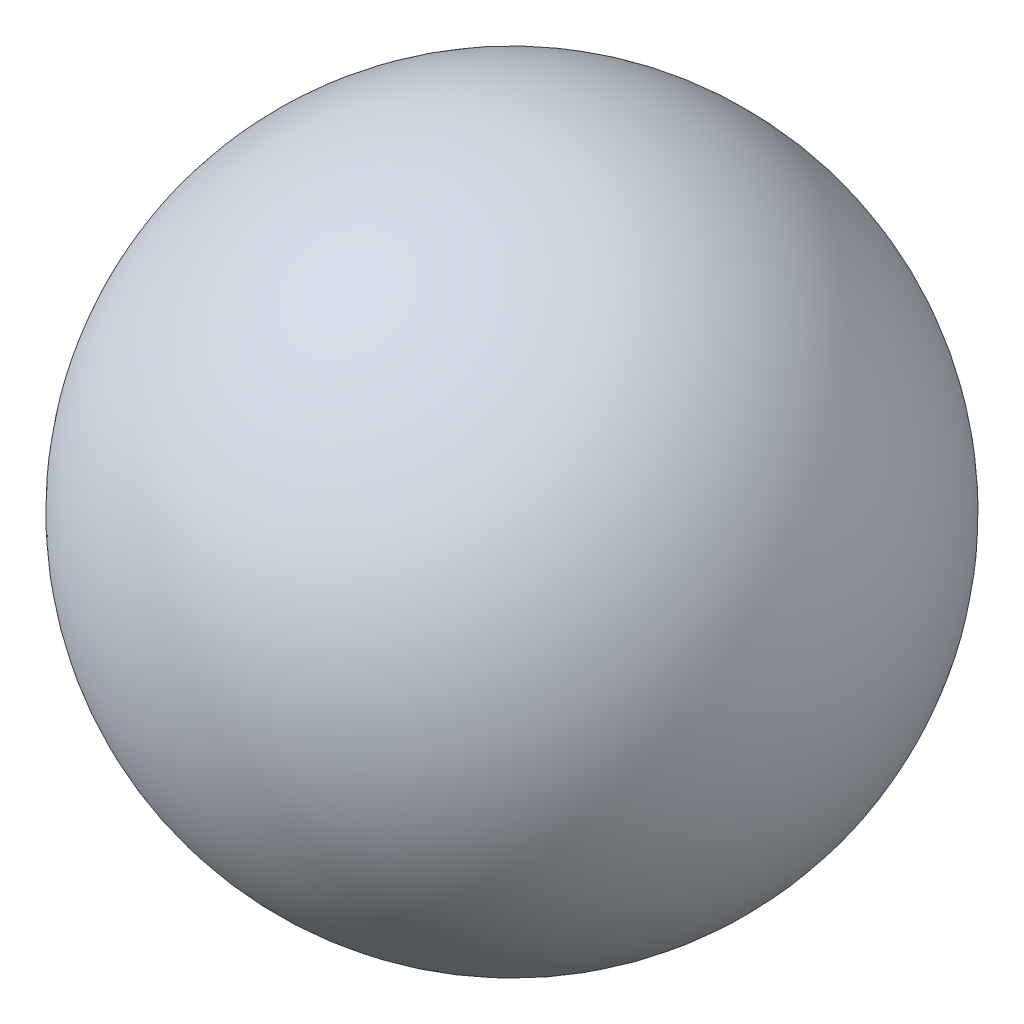
ISO-10303-21;
HEADER;
FILE_DESCRIPTION(('STEP AP214'),'2;1');
FILE_NAME('part.step','',(''),(''),'','','');
FILE_SCHEMA(('AUTOMOTIVE_DESIGN { 1 0 10303 214 1 1 1 1 }'));
ENDSEC;
DATA;
#1=APPLICATION_CONTEXT('core data for automotive mechanical design processes');
#2=APPLICATION_PROTOCOL_DEFINITION('international standard','automotive_design',2000,#1);
#3=PRODUCT_CONTEXT('',#1,'mechanical');
#4=PRODUCT('Part','Part','',(#3));
#5=PRODUCT_RELATED_PRODUCT_CATEGORY('part','',(#4));
#6=PRODUCT_DEFINITION_FORMATION('','',#4);
#7=PRODUCT_DEFINITION_CONTEXT('part definition',#1,'design');
#8=PRODUCT_DEFINITION('design','',#6,#7);
#9=PRODUCT_DEFINITION_SHAPE('','',#8);
#10=(LENGTH_UNIT() NAMED_UNIT(*) SI_UNIT(.MILLI.,.METRE.));
#11=(NAMED_UNIT(*) PLANE_ANGLE_UNIT() SI_UNIT($,.RADIAN.));
#12=(NAMED_UNIT(*) SI_UNIT($,.STERADIAN.) SOLID_ANGLE_UNIT());
#13=UNCERTAINTY_MEASURE_WITH_UNIT(LENGTH_MEASURE(1.E-05),#10,'distance_accuracy_value','');
#14=(GEOMETRIC_REPRESENTATION_CONTEXT(3) GLOBAL_UNCERTAINTY_ASSIGNED_CONTEXT((#13)) GLOBAL_UNIT_ASSIGNED_CONTEXT((#10,
#11,#12)) REPRESENTATION_CONTEXT('',''));
#15=CARTESIAN_POINT('',(0.,0.,0.));
#16=DIRECTION('',(0.,0.,1.));
#17=DIRECTION('',(1.,0.,0.));
#18=AXIS2_PLACEMENT_3D('',#15,#16,#17);
#19=CARTESIAN_POINT('',(41.7,66.275,0.));
#20=DIRECTION('',(-1.,0.,0.));
#21=DIRECTION('',(0.,1.,0.));
#22=AXIS2_PLACEMENT_3D('',#19,#20,#21);
#23=SPHERICAL_SURFACE('',#22,11.906);
#24=CARTESIAN_POINT('',(29.794,66.275,0.));
#25=VERTEX_POINT('',#24);
#26=VERTEX_LOOP('',#25);
#27=FACE_BOUND('',#26,.T.);
#28=ADVANCED_FACE('F29',(#27),#23,.T.);
#29=CLOSED_SHELL('',(#28));
#30=MANIFOLD_SOLID_BREP('B2',#29);
#31=ADVANCED_BREP_SHAPE_REPRESENTATION('',(#18,#30),#14);
#32=SHAPE_DEFINITION_REPRESENTATION(#9,#31);
ENDSEC;
END-ISO-10303-21;
